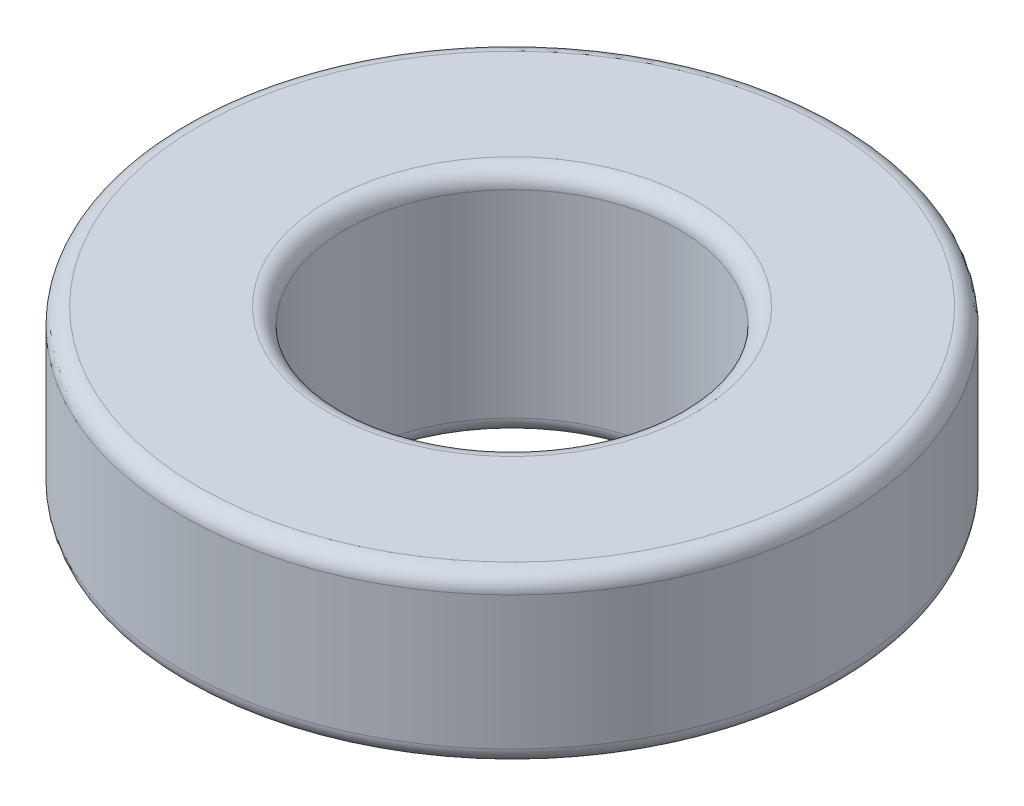
ISO-10303-21;
HEADER;
FILE_DESCRIPTION(('STEP AP214'),'2;1');
FILE_NAME('part.step','',(''),(''),'','','');
FILE_SCHEMA(('AUTOMOTIVE_DESIGN { 1 0 10303 214 1 1 1 1 }'));
ENDSEC;
DATA;
#1=APPLICATION_CONTEXT('core data for automotive mechanical design processes');
#2=APPLICATION_PROTOCOL_DEFINITION('international standard','automotive_design',2000,#1);
#3=PRODUCT_CONTEXT('',#1,'mechanical');
#4=PRODUCT('Part','Part','',(#3));
#5=PRODUCT_RELATED_PRODUCT_CATEGORY('part','',(#4));
#6=PRODUCT_DEFINITION_FORMATION('','',#4);
#7=PRODUCT_DEFINITION_CONTEXT('part definition',#1,'design');
#8=PRODUCT_DEFINITION('design','',#6,#7);
#9=PRODUCT_DEFINITION_SHAPE('','',#8);
#10=(LENGTH_UNIT() NAMED_UNIT(*) SI_UNIT(.MILLI.,.METRE.));
#11=(NAMED_UNIT(*) PLANE_ANGLE_UNIT() SI_UNIT($,.RADIAN.));
#12=(NAMED_UNIT(*) SI_UNIT($,.STERADIAN.) SOLID_ANGLE_UNIT());
#13=UNCERTAINTY_MEASURE_WITH_UNIT(LENGTH_MEASURE(1.E-05),#10,'distance_accuracy_value','');
#14=(GEOMETRIC_REPRESENTATION_CONTEXT(3) GLOBAL_UNCERTAINTY_ASSIGNED_CONTEXT((#13)) GLOBAL_UNIT_ASSIGNED_CONTEXT((#10,
#11,#12)) REPRESENTATION_CONTEXT('',''));
#15=CARTESIAN_POINT('',(0.,0.,0.));
#16=DIRECTION('',(0.,0.,1.));
#17=DIRECTION('',(1.,0.,0.));
#18=AXIS2_PLACEMENT_3D('',#15,#16,#17);
#19=CARTESIAN_POINT('',(0.,0.,0.));
#20=DIRECTION('',(0.,1.,0.));
#21=DIRECTION('',(0.,0.,1.));
#22=AXIS2_PLACEMENT_3D('',#19,#20,#21);
#23=PLANE('',#22);
#24=CARTESIAN_POINT('',(0.,0.,0.));
#25=DIRECTION('',(0.,1.,0.));
#26=DIRECTION('',(0.,0.,1.));
#27=AXIS2_PLACEMENT_3D('',#24,#25,#26);
#28=CIRCLE('',#27,2.2);
#29=CARTESIAN_POINT('',(0.,0.,2.2));
#30=VERTEX_POINT('',#29);
#31=EDGE_CURVE('E52',#30,#30,#28,.T.);
#32=ORIENTED_EDGE('',*,*,#31,.T.);
#33=EDGE_LOOP('',(#32));
#34=FACE_BOUND('',#33,.T.);
#35=CARTESIAN_POINT('',(0.,0.,0.));
#36=DIRECTION('',(0.,1.,0.));
#37=DIRECTION('',(0.,0.,1.));
#38=AXIS2_PLACEMENT_3D('',#35,#36,#37);
#39=CIRCLE('',#38,2.69);
#40=CARTESIAN_POINT('',(0.,0.,2.69));
#41=VERTEX_POINT('',#40);
#42=EDGE_CURVE('E65',#41,#41,#39,.T.);
#43=ORIENTED_EDGE('',*,*,#42,.F.);
#44=EDGE_LOOP('',(#43));
#45=FACE_BOUND('',#44,.T.);
#46=ADVANCED_FACE('F32',(#34,#45),#23,.F.);
#47=CARTESIAN_POINT('',(0.,0.77,0.));
#48=DIRECTION('',(0.,-1.,0.));
#49=DIRECTION('',(0.,0.,-1.));
#50=AXIS2_PLACEMENT_3D('',#47,#48,#49);
#51=CYLINDRICAL_SURFACE('',#50,2.69);
#52=CARTESIAN_POINT('',(0.,0.77,0.));
#53=DIRECTION('',(0.,1.,0.));
#54=DIRECTION('',(0.,0.,1.));
#55=AXIS2_PLACEMENT_3D('',#52,#53,#54);
#56=CIRCLE('',#55,2.69);
#57=CARTESIAN_POINT('',(0.,0.77,2.69));
#58=VERTEX_POINT('',#57);
#59=EDGE_CURVE('E64',#58,#58,#56,.T.);
#60=ORIENTED_EDGE('',*,*,#59,.F.);
#61=EDGE_LOOP('',(#60));
#62=FACE_BOUND('',#61,.T.);
#63=ORIENTED_EDGE('',*,*,#42,.T.);
#64=EDGE_LOOP('',(#63));
#65=FACE_BOUND('',#64,.T.);
#66=ADVANCED_FACE('F73',(#62,#65),#51,.T.);
#67=CARTESIAN_POINT('',(0.,0.77,0.));
#68=DIRECTION('',(0.,-1.,0.));
#69=DIRECTION('',(0.,0.,-1.));
#70=AXIS2_PLACEMENT_3D('',#67,#68,#69);
#71=CYLINDRICAL_SURFACE('',#70,2.);
#72=CARTESIAN_POINT('',(0.,0.2,0.));
#73=DIRECTION('',(0.,1.,0.));
#74=DIRECTION('',(0.,0.,1.));
#75=AXIS2_PLACEMENT_3D('',#72,#73,#74);
#76=CIRCLE('',#75,2.);
#77=CARTESIAN_POINT('',(0.,0.2,2.));
#78=VERTEX_POINT('',#77);
#79=EDGE_CURVE('E43',#78,#78,#76,.F.);
#80=ORIENTED_EDGE('',*,*,#79,.T.);
#81=EDGE_LOOP('',(#80));
#82=FACE_BOUND('',#81,.T.);
#83=CARTESIAN_POINT('',(0.,2.57,0.));
#84=DIRECTION('',(0.,1.,0.));
#85=DIRECTION('',(0.,0.,1.));
#86=AXIS2_PLACEMENT_3D('',#83,#84,#85);
#87=CIRCLE('',#86,2.);
#88=CARTESIAN_POINT('',(0.,2.57,2.));
#89=VERTEX_POINT('',#88);
#90=EDGE_CURVE('E47',#89,#89,#87,.T.);
#91=ORIENTED_EDGE('',*,*,#90,.T.);
#92=EDGE_LOOP('',(#91));
#93=FACE_BOUND('',#92,.T.);
#94=ADVANCED_FACE('F76',(#82,#93),#71,.F.);
#95=CARTESIAN_POINT('',(0.,2.77,0.));
#96=DIRECTION('',(0.,1.,0.));
#97=DIRECTION('',(0.,0.,1.));
#98=AXIS2_PLACEMENT_3D('',#95,#96,#97);
#99=PLANE('',#98);
#100=CARTESIAN_POINT('',(0.,2.77,0.));
#101=DIRECTION('',(0.,1.,0.));
#102=DIRECTION('',(0.,0.,1.));
#103=AXIS2_PLACEMENT_3D('',#100,#101,#102);
#104=CIRCLE('',#103,2.2);
#105=CARTESIAN_POINT('',(0.,2.77,2.2));
#106=VERTEX_POINT('',#105);
#107=EDGE_CURVE('E10',#106,#106,#104,.F.);
#108=ORIENTED_EDGE('',*,*,#107,.T.);
#109=EDGE_LOOP('',(#108));
#110=FACE_BOUND('',#109,.T.);
#111=CARTESIAN_POINT('',(0.,2.77,0.));
#112=DIRECTION('',(0.,1.,0.));
#113=DIRECTION('',(0.,0.,1.));
#114=AXIS2_PLACEMENT_3D('',#111,#112,#113);
#115=CIRCLE('',#114,3.75);
#116=CARTESIAN_POINT('',(0.,2.77,3.75));
#117=VERTEX_POINT('',#116);
#118=EDGE_CURVE('E39',#117,#117,#115,.T.);
#119=ORIENTED_EDGE('',*,*,#118,.T.);
#120=EDGE_LOOP('',(#119));
#121=FACE_BOUND('',#120,.T.);
#122=ADVANCED_FACE('F107',(#110,#121),#99,.T.);
#123=CARTESIAN_POINT('',(0.,0.77,0.));
#124=DIRECTION('',(0.,1.,0.));
#125=DIRECTION('',(0.,0.,1.));
#126=AXIS2_PLACEMENT_3D('',#123,#124,#125);
#127=PLANE('',#126);
#128=CARTESIAN_POINT('',(0.,0.77,0.));
#129=DIRECTION('',(0.,1.,0.));
#130=DIRECTION('',(0.,0.,1.));
#131=AXIS2_PLACEMENT_3D('',#128,#129,#130);
#132=CIRCLE('',#131,3.75);
#133=CARTESIAN_POINT('',(0.,0.77,3.75));
#134=VERTEX_POINT('',#133);
#135=EDGE_CURVE('E55',#134,#134,#132,.F.);
#136=ORIENTED_EDGE('',*,*,#135,.T.);
#137=EDGE_LOOP('',(#136));
#138=FACE_BOUND('',#137,.T.);
#139=ORIENTED_EDGE('',*,*,#59,.T.);
#140=EDGE_LOOP('',(#139));
#141=FACE_BOUND('',#140,.T.);
#142=ADVANCED_FACE('F71',(#138,#141),#127,.F.);
#143=CARTESIAN_POINT('',(0.,2.77,0.));
#144=DIRECTION('',(0.,-1.,0.));
#145=DIRECTION('',(0.,0.,-1.));
#146=AXIS2_PLACEMENT_3D('',#143,#144,#145);
#147=CYLINDRICAL_SURFACE('',#146,3.95);
#148=CARTESIAN_POINT('',(0.,0.97,0.));
#149=DIRECTION('',(0.,1.,0.));
#150=DIRECTION('',(0.,0.,1.));
#151=AXIS2_PLACEMENT_3D('',#148,#149,#150);
#152=CIRCLE('',#151,3.95);
#153=CARTESIAN_POINT('',(0.,0.97,3.95));
#154=VERTEX_POINT('',#153);
#155=EDGE_CURVE('E58',#154,#154,#152,.T.);
#156=ORIENTED_EDGE('',*,*,#155,.T.);
#157=EDGE_LOOP('',(#156));
#158=FACE_BOUND('',#157,.T.);
#159=CARTESIAN_POINT('',(0.,2.57,0.));
#160=DIRECTION('',(0.,1.,0.));
#161=DIRECTION('',(0.,0.,1.));
#162=AXIS2_PLACEMENT_3D('',#159,#160,#161);
#163=CIRCLE('',#162,3.95);
#164=CARTESIAN_POINT('',(0.,2.57,3.95));
#165=VERTEX_POINT('',#164);
#166=EDGE_CURVE('E61',#165,#165,#163,.F.);
#167=ORIENTED_EDGE('',*,*,#166,.T.);
#168=EDGE_LOOP('',(#167));
#169=FACE_BOUND('',#168,.T.);
#170=ADVANCED_FACE('F92',(#158,#169),#147,.T.);
#171=CARTESIAN_POINT('',(0.,0.97,0.));
#172=DIRECTION('',(0.,1.,0.));
#173=DIRECTION('',(0.,0.,1.));
#174=AXIS2_PLACEMENT_3D('',#171,#172,#173);
#175=TOROIDAL_SURFACE('',#174,3.75,0.2);
#176=ORIENTED_EDGE('',*,*,#135,.F.);
#177=EDGE_LOOP('',(#176));
#178=FACE_BOUND('',#177,.T.);
#179=ORIENTED_EDGE('',*,*,#155,.F.);
#180=EDGE_LOOP('',(#179));
#181=FACE_BOUND('',#180,.T.);
#182=ADVANCED_FACE('F88',(#178,#181),#175,.T.);
#183=CARTESIAN_POINT('',(0.,0.2,0.));
#184=DIRECTION('',(0.,1.,0.));
#185=DIRECTION('',(0.,0.,1.));
#186=AXIS2_PLACEMENT_3D('',#183,#184,#185);
#187=TOROIDAL_SURFACE('',#186,2.2,0.2);
#188=ORIENTED_EDGE('',*,*,#79,.F.);
#189=EDGE_LOOP('',(#188));
#190=FACE_BOUND('',#189,.T.);
#191=ORIENTED_EDGE('',*,*,#31,.F.);
#192=EDGE_LOOP('',(#191));
#193=FACE_BOUND('',#192,.T.);
#194=ADVANCED_FACE('F91',(#190,#193),#187,.T.);
#195=CARTESIAN_POINT('',(0.,2.57,0.));
#196=DIRECTION('',(0.,1.,0.));
#197=DIRECTION('',(0.,0.,1.));
#198=AXIS2_PLACEMENT_3D('',#195,#196,#197);
#199=TOROIDAL_SURFACE('',#198,2.2,0.2);
#200=ORIENTED_EDGE('',*,*,#107,.F.);
#201=EDGE_LOOP('',(#200));
#202=FACE_BOUND('',#201,.T.);
#203=ORIENTED_EDGE('',*,*,#90,.F.);
#204=EDGE_LOOP('',(#203));
#205=FACE_BOUND('',#204,.T.);
#206=ADVANCED_FACE('F95',(#202,#205),#199,.T.);
#207=CARTESIAN_POINT('',(0.,2.57,0.));
#208=DIRECTION('',(0.,1.,0.));
#209=DIRECTION('',(0.,0.,1.));
#210=AXIS2_PLACEMENT_3D('',#207,#208,#209);
#211=TOROIDAL_SURFACE('',#210,3.75,0.2);
#212=ORIENTED_EDGE('',*,*,#166,.F.);
#213=EDGE_LOOP('',(#212));
#214=FACE_BOUND('',#213,.T.);
#215=ORIENTED_EDGE('',*,*,#118,.F.);
#216=EDGE_LOOP('',(#215));
#217=FACE_BOUND('',#216,.T.);
#218=ADVANCED_FACE('F34',(#214,#217),#211,.T.);
#219=CLOSED_SHELL('',(#46,#66,#94,#122,#142,#170,#182,#194,#206,#218));
#220=MANIFOLD_SOLID_BREP('B2',#219);
#221=ADVANCED_BREP_SHAPE_REPRESENTATION('',(#18,#220),#14);
#222=SHAPE_DEFINITION_REPRESENTATION(#9,#221);
ENDSEC;
END-ISO-10303-21;
